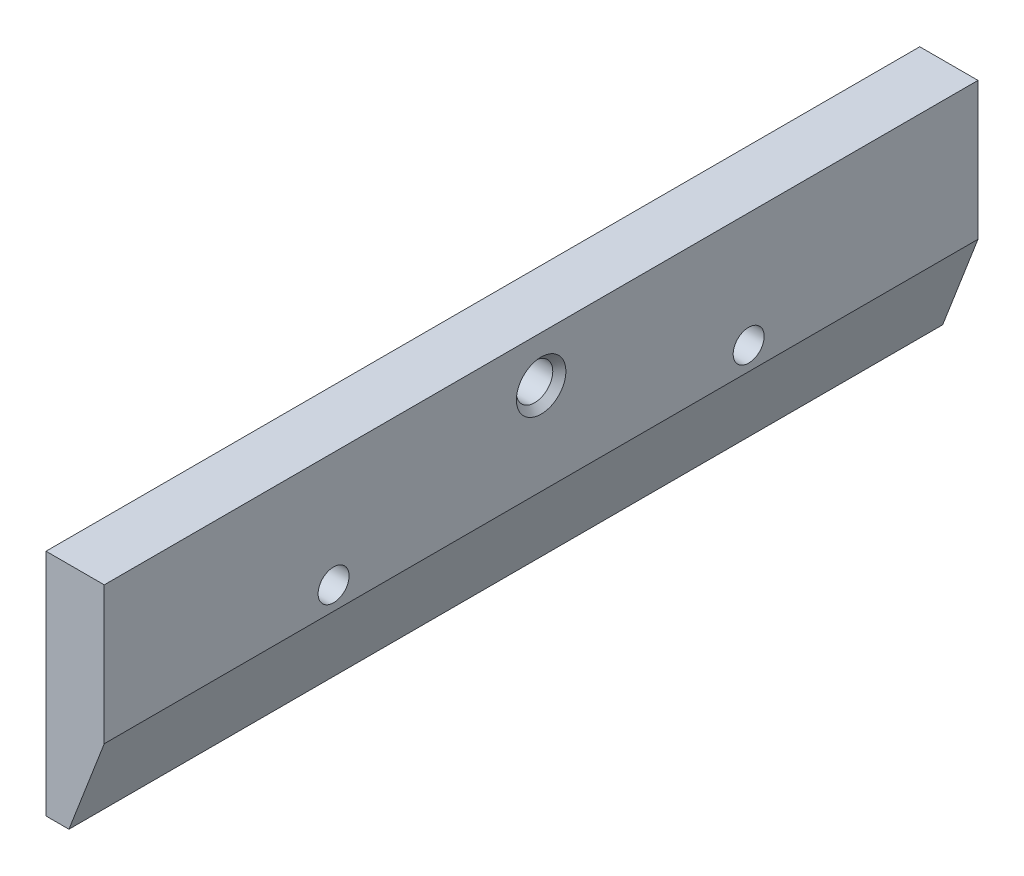
ISO-10303-21;
HEADER;
FILE_DESCRIPTION(('STEP AP214'),'2;1');
FILE_NAME('part.step','',(''),(''),'','','');
FILE_SCHEMA(('AUTOMOTIVE_DESIGN { 1 0 10303 214 1 1 1 1 }'));
ENDSEC;
DATA;
#1=APPLICATION_CONTEXT('core data for automotive mechanical design processes');
#2=APPLICATION_PROTOCOL_DEFINITION('international standard','automotive_design',2000,#1);
#3=PRODUCT_CONTEXT('',#1,'mechanical');
#4=PRODUCT('Part','Part','',(#3));
#5=PRODUCT_RELATED_PRODUCT_CATEGORY('part','',(#4));
#6=PRODUCT_DEFINITION_FORMATION('','',#4);
#7=PRODUCT_DEFINITION_CONTEXT('part definition',#1,'design');
#8=PRODUCT_DEFINITION('design','',#6,#7);
#9=PRODUCT_DEFINITION_SHAPE('','',#8);
#10=(LENGTH_UNIT() NAMED_UNIT(*) SI_UNIT(.MILLI.,.METRE.));
#11=(NAMED_UNIT(*) PLANE_ANGLE_UNIT() SI_UNIT($,.RADIAN.));
#12=(NAMED_UNIT(*) SI_UNIT($,.STERADIAN.) SOLID_ANGLE_UNIT());
#13=UNCERTAINTY_MEASURE_WITH_UNIT(LENGTH_MEASURE(1.E-05),#10,'distance_accuracy_value','');
#14=(GEOMETRIC_REPRESENTATION_CONTEXT(3) GLOBAL_UNCERTAINTY_ASSIGNED_CONTEXT((#13)) GLOBAL_UNIT_ASSIGNED_CONTEXT((#10,
#11,#12)) REPRESENTATION_CONTEXT('',''));
#15=CARTESIAN_POINT('',(0.,0.,0.));
#16=DIRECTION('',(0.,0.,1.));
#17=DIRECTION('',(1.,0.,0.));
#18=AXIS2_PLACEMENT_3D('',#15,#16,#17);
#19=CARTESIAN_POINT('',(-6.35,25.,95.25));
#20=DIRECTION('',(1.,0.,0.));
#21=DIRECTION('',(0.,0.,-1.));
#22=AXIS2_PLACEMENT_3D('',#19,#20,#21);
#23=PLANE('',#22);
#24=CARTESIAN_POINT('',(-6.35,15.,0.));
#25=DIRECTION('',(1.,0.,0.));
#26=DIRECTION('',(0.,0.,-1.));
#27=AXIS2_PLACEMENT_3D('',#24,#25,#26);
#28=CIRCLE('',#27,5.3975);
#29=CARTESIAN_POINT('',(-6.35,15.,-5.3975));
#30=VERTEX_POINT('',#29);
#31=EDGE_CURVE('E146',#30,#30,#28,.T.);
#32=ORIENTED_EDGE('',*,*,#31,.T.);
#33=EDGE_LOOP('',(#32));
#34=FACE_BOUND('',#33,.T.);
#35=CARTESIAN_POINT('',(-6.35000000000001,0.,45.25));
#36=DIRECTION('',(1.,0.,0.));
#37=DIRECTION('',(0.,0.,-1.));
#38=AXIS2_PLACEMENT_3D('',#35,#36,#37);
#39=CIRCLE('',#38,3.3782);
#40=CARTESIAN_POINT('',(-6.35000000000001,0.,41.8718));
#41=VERTEX_POINT('',#40);
#42=EDGE_CURVE('E150',#41,#41,#39,.T.);
#43=ORIENTED_EDGE('',*,*,#42,.T.);
#44=EDGE_LOOP('',(#43));
#45=FACE_BOUND('',#44,.T.);
#46=CARTESIAN_POINT('',(-6.35000000000001,0.,-45.25));
#47=DIRECTION('',(1.,0.,0.));
#48=DIRECTION('',(0.,0.,-1.));
#49=AXIS2_PLACEMENT_3D('',#46,#47,#48);
#50=CIRCLE('',#49,3.3782);
#51=CARTESIAN_POINT('',(-6.35000000000001,0.,-48.6282));
#52=VERTEX_POINT('',#51);
#53=EDGE_CURVE('E113',#52,#52,#50,.T.);
#54=ORIENTED_EDGE('',*,*,#53,.T.);
#55=EDGE_LOOP('',(#54));
#56=FACE_BOUND('',#55,.T.);
#57=DIRECTION('',(0.,-1.,0.));
#58=VECTOR('',#57,1.);
#59=CARTESIAN_POINT('',(-6.35,25.,-95.25));
#60=LINE('',#59,#58);
#61=CARTESIAN_POINT('',(-6.35,25.,-95.25));
#62=VERTEX_POINT('',#61);
#63=CARTESIAN_POINT('',(-6.35,-25.,-95.25));
#64=VERTEX_POINT('',#63);
#65=EDGE_CURVE('E109',#62,#64,#60,.T.);
#66=ORIENTED_EDGE('',*,*,#65,.T.);
#67=DIRECTION('',(0.,0.,-1.));
#68=VECTOR('',#67,1.);
#69=CARTESIAN_POINT('',(-6.35,-25.,95.25));
#70=LINE('',#69,#68);
#71=CARTESIAN_POINT('',(-6.35,-25.,95.25));
#72=VERTEX_POINT('',#71);
#73=EDGE_CURVE('E11',#72,#64,#70,.T.);
#74=ORIENTED_EDGE('',*,*,#73,.F.);
#75=DIRECTION('',(0.,-1.,0.));
#76=VECTOR('',#75,1.);
#77=CARTESIAN_POINT('',(-6.35,25.,95.25));
#78=LINE('',#77,#76);
#79=CARTESIAN_POINT('',(-6.35,25.,95.25));
#80=VERTEX_POINT('',#79);
#81=EDGE_CURVE('E118',#80,#72,#78,.T.);
#82=ORIENTED_EDGE('',*,*,#81,.F.);
#83=DIRECTION('',(0.,0.,-1.));
#84=VECTOR('',#83,1.);
#85=CARTESIAN_POINT('',(-6.35,25.,95.25));
#86=LINE('',#85,#84);
#87=EDGE_CURVE('E105',#80,#62,#86,.T.);
#88=ORIENTED_EDGE('',*,*,#87,.T.);
#89=EDGE_LOOP('',(#66,#74,#82,#88));
#90=FACE_BOUND('',#89,.T.);
#91=ADVANCED_FACE('F35',(#34,#45,#56,#90),#23,.F.);
#92=CARTESIAN_POINT('',(-1.34999999999999,-25.,95.25));
#93=DIRECTION('',(0.,1.,0.));
#94=DIRECTION('',(0.,0.,1.));
#95=AXIS2_PLACEMENT_3D('',#92,#93,#94);
#96=PLANE('',#95);
#97=DIRECTION('',(1.,0.,0.));
#98=VECTOR('',#97,1.);
#99=CARTESIAN_POINT('',(-1.34999999999999,-25.,-95.25));
#100=LINE('',#99,#98);
#101=CARTESIAN_POINT('',(-1.34999999999999,-25.,-95.25));
#102=VERTEX_POINT('',#101);
#103=EDGE_CURVE('E112',#64,#102,#100,.T.);
#104=ORIENTED_EDGE('',*,*,#103,.T.);
#105=DIRECTION('',(0.,0.,-1.));
#106=VECTOR('',#105,1.);
#107=CARTESIAN_POINT('',(-1.34999999999999,-25.,95.25));
#108=LINE('',#107,#106);
#109=CARTESIAN_POINT('',(-1.34999999999999,-25.,95.25));
#110=VERTEX_POINT('',#109);
#111=EDGE_CURVE('E43',#110,#102,#108,.T.);
#112=ORIENTED_EDGE('',*,*,#111,.F.);
#113=DIRECTION('',(1.,0.,0.));
#114=VECTOR('',#113,1.);
#115=CARTESIAN_POINT('',(-1.34999999999999,-25.,95.25));
#116=LINE('',#115,#114);
#117=EDGE_CURVE('E85',#72,#110,#116,.T.);
#118=ORIENTED_EDGE('',*,*,#117,.F.);
#119=ORIENTED_EDGE('',*,*,#73,.T.);
#120=EDGE_LOOP('',(#104,#112,#118,#119));
#121=FACE_BOUND('',#120,.T.);
#122=ADVANCED_FACE('F138',(#121),#96,.F.);
#123=CARTESIAN_POINT('',(-1.34999999999999,-25.,95.25));
#124=DIRECTION('',(-0.933225292836745,0.359291737742147,0.));
#125=DIRECTION('',(-0.359291737742147,-0.933225292836745,0.));
#126=AXIS2_PLACEMENT_3D('',#123,#124,#125);
#127=PLANE('',#126);
#128=DIRECTION('',(0.359291737742147,0.933225292836745,0.));
#129=VECTOR('',#128,1.);
#130=CARTESIAN_POINT('',(-1.34999999999999,-25.,-95.25));
#131=LINE('',#130,#129);
#132=CARTESIAN_POINT('',(6.35000000000001,-5.,-95.25));
#133=VERTEX_POINT('',#132);
#134=EDGE_CURVE('E100',#102,#133,#131,.T.);
#135=ORIENTED_EDGE('',*,*,#134,.T.);
#136=DIRECTION('',(0.,0.,-1.));
#137=VECTOR('',#136,1.);
#138=CARTESIAN_POINT('',(6.35000000000001,-5.,95.25));
#139=LINE('',#138,#137);
#140=CARTESIAN_POINT('',(6.35000000000001,-5.,95.25));
#141=VERTEX_POINT('',#140);
#142=EDGE_CURVE('E97',#141,#133,#139,.T.);
#143=ORIENTED_EDGE('',*,*,#142,.F.);
#144=DIRECTION('',(0.359291737742147,0.933225292836745,0.));
#145=VECTOR('',#144,1.);
#146=CARTESIAN_POINT('',(-1.34999999999999,-25.,95.25));
#147=LINE('',#146,#145);
#148=EDGE_CURVE('E89',#110,#141,#147,.T.);
#149=ORIENTED_EDGE('',*,*,#148,.F.);
#150=ORIENTED_EDGE('',*,*,#111,.T.);
#151=EDGE_LOOP('',(#135,#143,#149,#150));
#152=FACE_BOUND('',#151,.T.);
#153=ADVANCED_FACE('F98',(#152),#127,.F.);
#154=CARTESIAN_POINT('',(6.35,25.,95.25));
#155=DIRECTION('',(-1.,0.,0.));
#156=DIRECTION('',(0.,-1.,0.));
#157=AXIS2_PLACEMENT_3D('',#154,#155,#156);
#158=PLANE('',#157);
#159=CARTESIAN_POINT('',(6.35000000000001,15.,0.));
#160=DIRECTION('',(1.,0.,0.));
#161=DIRECTION('',(0.,0.,-1.));
#162=AXIS2_PLACEMENT_3D('',#159,#160,#161);
#163=CIRCLE('',#162,5.3975);
#164=CARTESIAN_POINT('',(6.35000000000001,15.,-5.3975));
#165=VERTEX_POINT('',#164);
#166=EDGE_CURVE('E170',#165,#165,#163,.T.);
#167=ORIENTED_EDGE('',*,*,#166,.F.);
#168=EDGE_LOOP('',(#167));
#169=FACE_BOUND('',#168,.T.);
#170=CARTESIAN_POINT('',(6.35000000000001,0.,45.25));
#171=DIRECTION('',(1.,0.,0.));
#172=DIRECTION('',(0.,0.,-1.));
#173=AXIS2_PLACEMENT_3D('',#170,#171,#172);
#174=CIRCLE('',#173,3.3782);
#175=CARTESIAN_POINT('',(6.35000000000001,0.,41.8718));
#176=VERTEX_POINT('',#175);
#177=EDGE_CURVE('E161',#176,#176,#174,.T.);
#178=ORIENTED_EDGE('',*,*,#177,.F.);
#179=EDGE_LOOP('',(#178));
#180=FACE_BOUND('',#179,.T.);
#181=CARTESIAN_POINT('',(6.35000000000001,0.,-45.25));
#182=DIRECTION('',(1.,0.,0.));
#183=DIRECTION('',(0.,0.,-1.));
#184=AXIS2_PLACEMENT_3D('',#181,#182,#183);
#185=CIRCLE('',#184,3.3782);
#186=CARTESIAN_POINT('',(6.35000000000001,0.,-48.6282));
#187=VERTEX_POINT('',#186);
#188=EDGE_CURVE('E154',#187,#187,#185,.T.);
#189=ORIENTED_EDGE('',*,*,#188,.F.);
#190=EDGE_LOOP('',(#189));
#191=FACE_BOUND('',#190,.T.);
#192=DIRECTION('',(0.,1.,0.));
#193=VECTOR('',#192,1.);
#194=CARTESIAN_POINT('',(6.35,25.,-95.25));
#195=LINE('',#194,#193);
#196=CARTESIAN_POINT('',(6.35,25.,-95.25));
#197=VERTEX_POINT('',#196);
#198=EDGE_CURVE('E71',#133,#197,#195,.T.);
#199=ORIENTED_EDGE('',*,*,#198,.T.);
#200=DIRECTION('',(0.,0.,-1.));
#201=VECTOR('',#200,1.);
#202=CARTESIAN_POINT('',(6.35,25.,95.25));
#203=LINE('',#202,#201);
#204=CARTESIAN_POINT('',(6.35,25.,95.25));
#205=VERTEX_POINT('',#204);
#206=EDGE_CURVE('E101',#205,#197,#203,.T.);
#207=ORIENTED_EDGE('',*,*,#206,.F.);
#208=DIRECTION('',(0.,1.,0.));
#209=VECTOR('',#208,1.);
#210=CARTESIAN_POINT('',(6.35,25.,95.25));
#211=LINE('',#210,#209);
#212=EDGE_CURVE('E93',#141,#205,#211,.T.);
#213=ORIENTED_EDGE('',*,*,#212,.F.);
#214=ORIENTED_EDGE('',*,*,#142,.T.);
#215=EDGE_LOOP('',(#199,#207,#213,#214));
#216=FACE_BOUND('',#215,.T.);
#217=ADVANCED_FACE('F103',(#169,#180,#191,#216),#158,.F.);
#218=CARTESIAN_POINT('',(6.35,25.,95.25));
#219=DIRECTION('',(0.,-1.,0.));
#220=DIRECTION('',(0.,0.,-1.));
#221=AXIS2_PLACEMENT_3D('',#218,#219,#220);
#222=PLANE('',#221);
#223=DIRECTION('',(-1.,0.,0.));
#224=VECTOR('',#223,1.);
#225=CARTESIAN_POINT('',(6.35,25.,-95.25));
#226=LINE('',#225,#224);
#227=EDGE_CURVE('E77',#197,#62,#226,.T.);
#228=ORIENTED_EDGE('',*,*,#227,.T.);
#229=ORIENTED_EDGE('',*,*,#87,.F.);
#230=DIRECTION('',(-1.,0.,0.));
#231=VECTOR('',#230,1.);
#232=CARTESIAN_POINT('',(6.35,25.,95.25));
#233=LINE('',#232,#231);
#234=EDGE_CURVE('E51',#205,#80,#233,.T.);
#235=ORIENTED_EDGE('',*,*,#234,.F.);
#236=ORIENTED_EDGE('',*,*,#206,.T.);
#237=EDGE_LOOP('',(#228,#229,#235,#236));
#238=FACE_BOUND('',#237,.T.);
#239=ADVANCED_FACE('F126',(#238),#222,.F.);
#240=CARTESIAN_POINT('',(0.,0.,95.25));
#241=DIRECTION('',(0.,0.,-1.));
#242=DIRECTION('',(-1.,0.,0.));
#243=AXIS2_PLACEMENT_3D('',#240,#241,#242);
#244=PLANE('',#243);
#245=ORIENTED_EDGE('',*,*,#81,.T.);
#246=ORIENTED_EDGE('',*,*,#117,.T.);
#247=ORIENTED_EDGE('',*,*,#148,.T.);
#248=ORIENTED_EDGE('',*,*,#212,.T.);
#249=ORIENTED_EDGE('',*,*,#234,.T.);
#250=EDGE_LOOP('',(#245,#246,#247,#248,#249));
#251=FACE_BOUND('',#250,.T.);
#252=ADVANCED_FACE('F91',(#251),#244,.F.);
#253=CARTESIAN_POINT('',(0.,0.,-95.25));
#254=DIRECTION('',(0.,0.,-1.));
#255=DIRECTION('',(-1.,0.,0.));
#256=AXIS2_PLACEMENT_3D('',#253,#254,#255);
#257=PLANE('',#256);
#258=ORIENTED_EDGE('',*,*,#65,.F.);
#259=ORIENTED_EDGE('',*,*,#227,.F.);
#260=ORIENTED_EDGE('',*,*,#198,.F.);
#261=ORIENTED_EDGE('',*,*,#134,.F.);
#262=ORIENTED_EDGE('',*,*,#103,.F.);
#263=EDGE_LOOP('',(#258,#259,#260,#261,#262));
#264=FACE_BOUND('',#263,.T.);
#265=ADVANCED_FACE('F122',(#264),#257,.T.);
#266=CARTESIAN_POINT('',(6.35000000000001,0.,-45.25));
#267=DIRECTION('',(1.,0.,0.));
#268=DIRECTION('',(0.,0.,-1.));
#269=AXIS2_PLACEMENT_3D('',#266,#267,#268);
#270=CYLINDRICAL_SURFACE('',#269,3.3782);
#271=ORIENTED_EDGE('',*,*,#53,.F.);
#272=EDGE_LOOP('',(#271));
#273=FACE_BOUND('',#272,.T.);
#274=ORIENTED_EDGE('',*,*,#188,.T.);
#275=EDGE_LOOP('',(#274));
#276=FACE_BOUND('',#275,.T.);
#277=ADVANCED_FACE('F181',(#273,#276),#270,.F.);
#278=CARTESIAN_POINT('',(6.35000000000001,0.,45.25));
#279=DIRECTION('',(1.,0.,0.));
#280=DIRECTION('',(0.,0.,-1.));
#281=AXIS2_PLACEMENT_3D('',#278,#279,#280);
#282=CYLINDRICAL_SURFACE('',#281,3.3782);
#283=ORIENTED_EDGE('',*,*,#42,.F.);
#284=EDGE_LOOP('',(#283));
#285=FACE_BOUND('',#284,.T.);
#286=ORIENTED_EDGE('',*,*,#177,.T.);
#287=EDGE_LOOP('',(#286));
#288=FACE_BOUND('',#287,.T.);
#289=ADVANCED_FACE('F183',(#285,#288),#282,.F.);
#290=CARTESIAN_POINT('',(-4.92124999999999,15.,0.));
#291=DIRECTION('',(-1.,0.,0.));
#292=DIRECTION('',(0.,0.,1.));
#293=AXIS2_PLACEMENT_3D('',#290,#291,#292);
#294=CONICAL_SURFACE('',#293,3.96875,0.785398163397447);
#295=ORIENTED_EDGE('',*,*,#31,.F.);
#296=EDGE_LOOP('',(#295));
#297=FACE_BOUND('',#296,.T.);
#298=CARTESIAN_POINT('',(-4.92124999999999,15.,0.));
#299=DIRECTION('',(1.,0.,0.));
#300=DIRECTION('',(0.,0.,-1.));
#301=AXIS2_PLACEMENT_3D('',#298,#299,#300);
#302=CIRCLE('',#301,3.96875);
#303=CARTESIAN_POINT('',(-4.92124999999999,15.,-3.96875));
#304=VERTEX_POINT('',#303);
#305=EDGE_CURVE('E164',#304,#304,#302,.T.);
#306=ORIENTED_EDGE('',*,*,#305,.T.);
#307=EDGE_LOOP('',(#306));
#308=FACE_BOUND('',#307,.T.);
#309=ADVANCED_FACE('F189',(#297,#308),#294,.F.);
#310=CARTESIAN_POINT('',(6.35000000000001,15.,0.));
#311=DIRECTION('',(1.,0.,0.));
#312=DIRECTION('',(0.,0.,-1.));
#313=AXIS2_PLACEMENT_3D('',#310,#311,#312);
#314=CYLINDRICAL_SURFACE('',#313,3.96875);
#315=ORIENTED_EDGE('',*,*,#305,.F.);
#316=EDGE_LOOP('',(#315));
#317=FACE_BOUND('',#316,.T.);
#318=CARTESIAN_POINT('',(4.92125000000001,15.,0.));
#319=DIRECTION('',(1.,0.,0.));
#320=DIRECTION('',(0.,0.,-1.));
#321=AXIS2_PLACEMENT_3D('',#318,#319,#320);
#322=CIRCLE('',#321,3.96875);
#323=CARTESIAN_POINT('',(4.92125000000001,15.,-3.96875));
#324=VERTEX_POINT('',#323);
#325=EDGE_CURVE('E167',#324,#324,#322,.T.);
#326=ORIENTED_EDGE('',*,*,#325,.T.);
#327=EDGE_LOOP('',(#326));
#328=FACE_BOUND('',#327,.T.);
#329=ADVANCED_FACE('F195',(#317,#328),#314,.F.);
#330=CARTESIAN_POINT('',(6.35000000000001,15.,0.));
#331=DIRECTION('',(1.,0.,0.));
#332=DIRECTION('',(0.,0.,-1.));
#333=AXIS2_PLACEMENT_3D('',#330,#331,#332);
#334=CONICAL_SURFACE('',#333,5.3975,0.785398163397448);
#335=ORIENTED_EDGE('',*,*,#325,.F.);
#336=EDGE_LOOP('',(#335));
#337=FACE_BOUND('',#336,.T.);
#338=ORIENTED_EDGE('',*,*,#166,.T.);
#339=EDGE_LOOP('',(#338));
#340=FACE_BOUND('',#339,.T.);
#341=ADVANCED_FACE('F175',(#337,#340),#334,.F.);
#342=CLOSED_SHELL('',(#91,#122,#153,#217,#239,#252,#265,#277,#289,#309,#329,#341));
#343=MANIFOLD_SOLID_BREP('B2',#342);
#344=ADVANCED_BREP_SHAPE_REPRESENTATION('',(#18,#343),#14);
#345=SHAPE_DEFINITION_REPRESENTATION(#9,#344);
ENDSEC;
END-ISO-10303-21;
